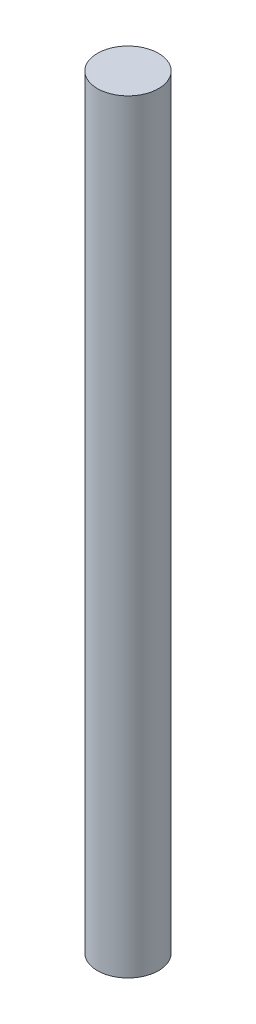
ISO-10303-21;
HEADER;
FILE_DESCRIPTION(('STEP AP214'),'2;1');
FILE_NAME('part.step','',(''),(''),'','','');
FILE_SCHEMA(('AUTOMOTIVE_DESIGN { 1 0 10303 214 1 1 1 1 }'));
ENDSEC;
DATA;
#1=APPLICATION_CONTEXT('core data for automotive mechanical design processes');
#2=APPLICATION_PROTOCOL_DEFINITION('international standard','automotive_design',2000,#1);
#3=PRODUCT_CONTEXT('',#1,'mechanical');
#4=PRODUCT('Part','Part','',(#3));
#5=PRODUCT_RELATED_PRODUCT_CATEGORY('part','',(#4));
#6=PRODUCT_DEFINITION_FORMATION('','',#4);
#7=PRODUCT_DEFINITION_CONTEXT('part definition',#1,'design');
#8=PRODUCT_DEFINITION('design','',#6,#7);
#9=PRODUCT_DEFINITION_SHAPE('','',#8);
#10=(LENGTH_UNIT() NAMED_UNIT(*) SI_UNIT(.MILLI.,.METRE.));
#11=(NAMED_UNIT(*) PLANE_ANGLE_UNIT() SI_UNIT($,.RADIAN.));
#12=(NAMED_UNIT(*) SI_UNIT($,.STERADIAN.) SOLID_ANGLE_UNIT());
#13=UNCERTAINTY_MEASURE_WITH_UNIT(LENGTH_MEASURE(1.E-05),#10,'distance_accuracy_value','');
#14=(GEOMETRIC_REPRESENTATION_CONTEXT(3) GLOBAL_UNCERTAINTY_ASSIGNED_CONTEXT((#13)) GLOBAL_UNIT_ASSIGNED_CONTEXT((#10,
#11,#12)) REPRESENTATION_CONTEXT('',''));
#15=CARTESIAN_POINT('',(0.,0.,0.));
#16=DIRECTION('',(0.,0.,1.));
#17=DIRECTION('',(1.,0.,0.));
#18=AXIS2_PLACEMENT_3D('',#15,#16,#17);
#19=CARTESIAN_POINT('',(0.,150.,0.));
#20=DIRECTION('',(0.,-1.,0.));
#21=DIRECTION('',(0.,0.,-1.));
#22=AXIS2_PLACEMENT_3D('',#19,#20,#21);
#23=CYLINDRICAL_SURFACE('',#22,6.);
#24=CARTESIAN_POINT('',(0.,150.,0.));
#25=DIRECTION('',(0.,1.,0.));
#26=DIRECTION('',(0.,0.,1.));
#27=AXIS2_PLACEMENT_3D('',#24,#25,#26);
#28=CIRCLE('',#27,6.);
#29=CARTESIAN_POINT('',(0.,150.,6.));
#30=VERTEX_POINT('',#29);
#31=EDGE_CURVE('E12',#30,#30,#28,.T.);
#32=ORIENTED_EDGE('',*,*,#31,.F.);
#33=EDGE_LOOP('',(#32));
#34=FACE_BOUND('',#33,.T.);
#35=CARTESIAN_POINT('',(0.,0.,0.));
#36=DIRECTION('',(0.,1.,0.));
#37=DIRECTION('',(0.,0.,1.));
#38=AXIS2_PLACEMENT_3D('',#35,#36,#37);
#39=CIRCLE('',#38,6.);
#40=CARTESIAN_POINT('',(0.,0.,6.));
#41=VERTEX_POINT('',#40);
#42=EDGE_CURVE('E45',#41,#41,#39,.T.);
#43=ORIENTED_EDGE('',*,*,#42,.T.);
#44=EDGE_LOOP('',(#43));
#45=FACE_BOUND('',#44,.T.);
#46=ADVANCED_FACE('F42',(#34,#45),#23,.T.);
#47=CARTESIAN_POINT('',(0.,150.,0.));
#48=DIRECTION('',(0.,1.,0.));
#49=DIRECTION('',(0.,0.,1.));
#50=AXIS2_PLACEMENT_3D('',#47,#48,#49);
#51=PLANE('',#50);
#52=ORIENTED_EDGE('',*,*,#31,.T.);
#53=EDGE_LOOP('',(#52));
#54=FACE_BOUND('',#53,.T.);
#55=ADVANCED_FACE('F57',(#54),#51,.T.);
#56=CARTESIAN_POINT('',(0.,0.,0.));
#57=DIRECTION('',(0.,1.,0.));
#58=DIRECTION('',(0.,0.,1.));
#59=AXIS2_PLACEMENT_3D('',#56,#57,#58);
#60=PLANE('',#59);
#61=ORIENTED_EDGE('',*,*,#42,.F.);
#62=EDGE_LOOP('',(#61));
#63=FACE_BOUND('',#62,.T.);
#64=ADVANCED_FACE('F55',(#63),#60,.F.);
#65=CLOSED_SHELL('',(#46,#55,#64));
#66=MANIFOLD_SOLID_BREP('B2',#65);
#67=ADVANCED_BREP_SHAPE_REPRESENTATION('',(#18,#66),#14);
#68=SHAPE_DEFINITION_REPRESENTATION(#9,#67);
ENDSEC;
END-ISO-10303-21;
